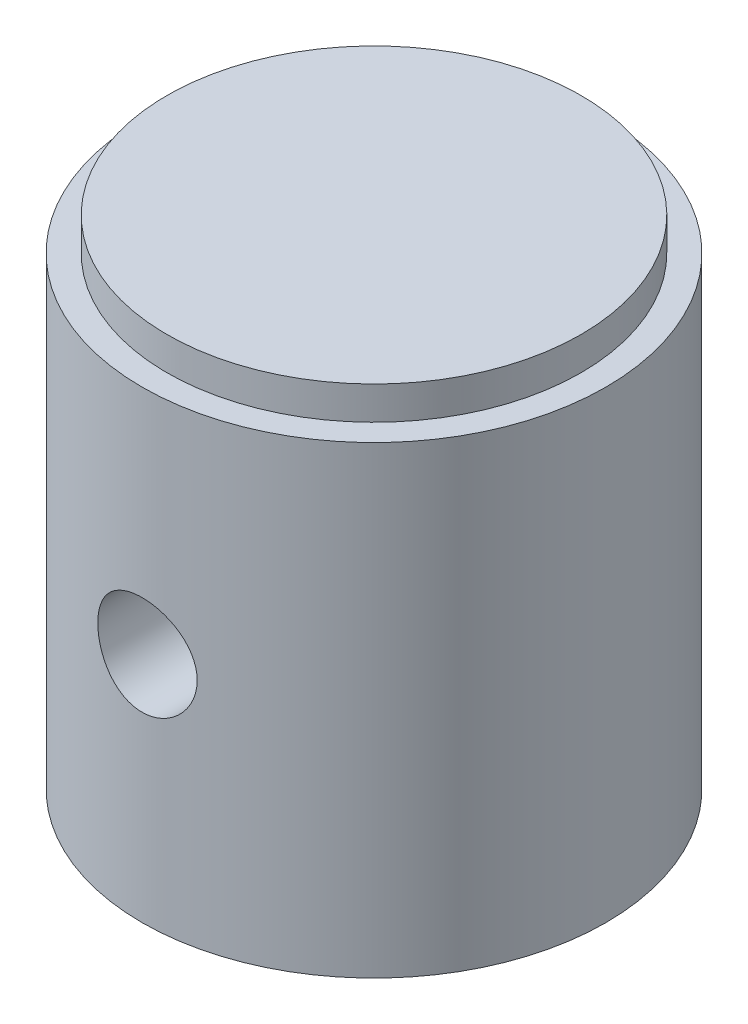
ISO-10303-21;
HEADER;
FILE_DESCRIPTION(('STEP AP214'),'2;1');
FILE_NAME('part.step','',(''),(''),'','','');
FILE_SCHEMA(('AUTOMOTIVE_DESIGN { 1 0 10303 214 1 1 1 1 }'));
ENDSEC;
DATA;
#1=APPLICATION_CONTEXT('core data for automotive mechanical design processes');
#2=APPLICATION_PROTOCOL_DEFINITION('international standard','automotive_design',2000,#1);
#3=PRODUCT_CONTEXT('',#1,'mechanical');
#4=PRODUCT('Part','Part','',(#3));
#5=PRODUCT_RELATED_PRODUCT_CATEGORY('part','',(#4));
#6=PRODUCT_DEFINITION_FORMATION('','',#4);
#7=PRODUCT_DEFINITION_CONTEXT('part definition',#1,'design');
#8=PRODUCT_DEFINITION('design','',#6,#7);
#9=PRODUCT_DEFINITION_SHAPE('','',#8);
#10=(LENGTH_UNIT() NAMED_UNIT(*) SI_UNIT(.MILLI.,.METRE.));
#11=(NAMED_UNIT(*) PLANE_ANGLE_UNIT() SI_UNIT($,.RADIAN.));
#12=(NAMED_UNIT(*) SI_UNIT($,.STERADIAN.) SOLID_ANGLE_UNIT());
#13=UNCERTAINTY_MEASURE_WITH_UNIT(LENGTH_MEASURE(1.E-05),#10,'distance_accuracy_value','');
#14=(GEOMETRIC_REPRESENTATION_CONTEXT(3) GLOBAL_UNCERTAINTY_ASSIGNED_CONTEXT((#13)) GLOBAL_UNIT_ASSIGNED_CONTEXT((#10,
#11,#12)) REPRESENTATION_CONTEXT('',''));
#15=CARTESIAN_POINT('',(0.,0.,0.));
#16=DIRECTION('',(0.,0.,1.));
#17=DIRECTION('',(1.,0.,0.));
#18=AXIS2_PLACEMENT_3D('',#15,#16,#17);
#19=CARTESIAN_POINT('',(-7.,-13.8540879403809,0.));
#20=DIRECTION('',(0.,1.,0.));
#21=DIRECTION('',(-1.,0.,0.));
#22=AXIS2_PLACEMENT_3D('',#19,#20,#21);
#23=PLANE('',#22);
#24=CARTESIAN_POINT('',(0.,-13.8540879403809,0.));
#25=DIRECTION('',(0.,-1.,0.));
#26=DIRECTION('',(1.,0.,0.));
#27=AXIS2_PLACEMENT_3D('',#24,#25,#26);
#28=CIRCLE('',#27,6.25);
#29=CARTESIAN_POINT('',(6.25000000000001,-13.8540879403809,0.));
#30=VERTEX_POINT('',#29);
#31=EDGE_CURVE('E62',#30,#30,#28,.T.);
#32=ORIENTED_EDGE('',*,*,#31,.F.);
#33=EDGE_LOOP('',(#32));
#34=FACE_BOUND('',#33,.T.);
#35=CARTESIAN_POINT('',(0.,-13.8540879403809,0.));
#36=DIRECTION('',(0.,-1.,0.));
#37=DIRECTION('',(1.,0.,0.));
#38=AXIS2_PLACEMENT_3D('',#35,#36,#37);
#39=CIRCLE('',#38,7.);
#40=CARTESIAN_POINT('',(7.,-13.8540879403809,0.));
#41=VERTEX_POINT('',#40);
#42=EDGE_CURVE('E116',#41,#41,#39,.T.);
#43=ORIENTED_EDGE('',*,*,#42,.T.);
#44=EDGE_LOOP('',(#43));
#45=FACE_BOUND('',#44,.T.);
#46=ADVANCED_FACE('F34',(#34,#45),#23,.F.);
#47=CARTESIAN_POINT('',(0.,-13.8540879403809,0.));
#48=DIRECTION('',(0.,-1.,0.));
#49=DIRECTION('',(1.,0.,0.));
#50=AXIS2_PLACEMENT_3D('',#47,#48,#49);
#51=CONICAL_SURFACE('',#50,6.25,0.349065850398867);
#52=CARTESIAN_POINT('',(0.,-9.73287181119897,0.));
#53=DIRECTION('',(0.,-1.,0.));
#54=DIRECTION('',(1.,0.,0.));
#55=AXIS2_PLACEMENT_3D('',#52,#53,#54);
#56=CIRCLE('',#55,4.75);
#57=CARTESIAN_POINT('',(4.75,-9.73287181119897,0.));
#58=VERTEX_POINT('',#57);
#59=EDGE_CURVE('E58',#58,#58,#56,.T.);
#60=ORIENTED_EDGE('',*,*,#59,.F.);
#61=EDGE_LOOP('',(#60));
#62=FACE_BOUND('',#61,.T.);
#63=ORIENTED_EDGE('',*,*,#31,.T.);
#64=EDGE_LOOP('',(#63));
#65=FACE_BOUND('',#64,.T.);
#66=ADVANCED_FACE('F100',(#62,#65),#51,.F.);
#67=CARTESIAN_POINT('',(0.,-1.1459120596191,0.));
#68=DIRECTION('',(0.,-1.,0.));
#69=DIRECTION('',(1.,0.,0.));
#70=AXIS2_PLACEMENT_3D('',#67,#68,#69);
#71=CYLINDRICAL_SURFACE('',#70,4.75);
#72=CARTESIAN_POINT('',(1.5,-6.8540879403809,-4.50693909432999));
#73=CARTESIAN_POINT('',(1.49999958004515,-6.93605622305704,-4.50693949515469));
#74=CARTESIAN_POINT('',(1.49325840231682,-7.01802892410564,-4.50919970874085));
#75=CARTESIAN_POINT('',(1.46655104887094,-7.17956294988035,-4.5179553253781));
#76=CARTESIAN_POINT('',(1.44658152131253,-7.25912365810358,-4.52445180182028));
#77=CARTESIAN_POINT('',(1.39417508352591,-7.41347014323043,-4.54087234787262));
#78=CARTESIAN_POINT('',(1.36176059537411,-7.48826422719241,-4.55079024986066));
#79=CARTESIAN_POINT('',(1.28545946652237,-7.63137399638555,-4.57292751994247));
#80=CARTESIAN_POINT('',(1.24157071835092,-7.69968848836886,-4.58514731070763));
#81=CARTESIAN_POINT('',(1.14191784971278,-7.83029661183296,-4.6109923380212));
#82=CARTESIAN_POINT('',(1.08582030493755,-7.89232950411681,-4.62464992232587));
#83=CARTESIAN_POINT('',(0.964055421977067,-8.00628229320441,-4.65155671093151));
#84=CARTESIAN_POINT('',(0.89838672023377,-8.05820074658454,-4.66480585671778));
#85=CARTESIAN_POINT('',(0.757464836701734,-8.15160644650628,-4.68977365915903));
#86=CARTESIAN_POINT('',(0.682025001056138,-8.19282445208425,-4.70144979545653));
#87=CARTESIAN_POINT('',(0.524852067423557,-8.26188519760547,-4.72157773016225));
#88=CARTESIAN_POINT('',(0.443120487221091,-8.28973115168705,-4.73003030329318));
#89=CARTESIAN_POINT('',(0.278414775826808,-8.33038467148202,-4.74252974850081));
#90=CARTESIAN_POINT('',(0.195560751143444,-8.34363804183695,-4.74670693307633));
#91=CARTESIAN_POINT('',(0.0287067286102967,-8.35614344447847,-4.75064554540298));
#92=CARTESIAN_POINT('',(-0.0552929988694204,-8.35539872489097,-4.75040799755164));
#93=CARTESIAN_POINT('',(-0.218913619351864,-8.34022074082502,-4.74563427350171));
#94=CARTESIAN_POINT('',(-0.298584494979865,-8.32627089066405,-4.74124990899214));
#95=CARTESIAN_POINT('',(-0.454390311754809,-8.28587278273048,-4.72886249486103));
#96=CARTESIAN_POINT('',(-0.530525020335841,-8.25942370418591,-4.72085920760149));
#97=CARTESIAN_POINT('',(-0.678203652675078,-8.19447175849607,-4.7019310355991));
#98=CARTESIAN_POINT('',(-0.749679013295809,-8.15582361270492,-4.69097118266663));
#99=CARTESIAN_POINT('',(-0.885279102378907,-8.06768762579376,-4.66728249867119));
#100=CARTESIAN_POINT('',(-0.949401935733848,-8.01819699955865,-4.65455321340063));
#101=CARTESIAN_POINT('',(-1.07135837440922,-7.90730597414598,-4.62803989727125));
#102=CARTESIAN_POINT('',(-1.12880871974839,-7.84548870632831,-4.61423403233704));
#103=CARTESIAN_POINT('',(-1.23264301054731,-7.71296978140175,-4.58758892442481));
#104=CARTESIAN_POINT('',(-1.2790255944206,-7.6422670328083,-4.57474980051078));
#105=CARTESIAN_POINT('',(-1.35986638692084,-7.49288116854965,-4.55138024059369));
#106=CARTESIAN_POINT('',(-1.39417963639867,-7.4141148017648,-4.54087839223385));
#107=CARTESIAN_POINT('',(-1.44893342452635,-7.25150983866529,-4.5237069894911));
#108=CARTESIAN_POINT('',(-1.46937907304313,-7.16767312306426,-4.51703602366211));
#109=CARTESIAN_POINT('',(-1.49507161979025,-7.00098558005699,-4.5085959379324));
#110=CARTESIAN_POINT('',(-1.50090655288536,-6.91823493670213,-4.50663729609299));
#111=CARTESIAN_POINT('',(-1.49886513965521,-6.75293022441442,-4.50731687465408));
#112=CARTESIAN_POINT('',(-1.49099096720734,-6.67037612639363,-4.50995436623754));
#113=CARTESIAN_POINT('',(-1.46228084598242,-6.51036125248343,-4.51934163323602));
#114=CARTESIAN_POINT('',(-1.4418371919129,-6.43282201971395,-4.5259668251803));
#115=CARTESIAN_POINT('',(-1.38903056686353,-6.28228400790209,-4.54245022183902));
#116=CARTESIAN_POINT('',(-1.35666562487664,-6.20928598201468,-4.55230896114271));
#117=CARTESIAN_POINT('',(-1.2798587413425,-6.06754623665939,-4.57450539166734));
#118=CARTESIAN_POINT('',(-1.2350921421442,-5.99899071210704,-4.58690698850857));
#119=CARTESIAN_POINT('',(-1.13512998682984,-5.87015089462233,-4.61266077618539));
#120=CARTESIAN_POINT('',(-1.07993166463933,-5.8098688028075,-4.62601321856053));
#121=CARTESIAN_POINT('',(-0.957886037531118,-5.69664616377291,-4.65285013455169));
#122=CARTESIAN_POINT('',(-0.890643665109766,-5.64412595749249,-4.66631614662306));
#123=CARTESIAN_POINT('',(-0.747973360630615,-5.55109663218957,-4.6912975579683));
#124=CARTESIAN_POINT('',(-0.672545793179843,-5.51058697846041,-4.70281304406929));
#125=CARTESIAN_POINT('',(-0.516099288450846,-5.44311557784927,-4.72253168708172));
#126=CARTESIAN_POINT('',(-0.435125281433141,-5.41605690859638,-4.73075845435933));
#127=CARTESIAN_POINT('',(-0.269469399491867,-5.3760348960379,-4.7430763734001));
#128=CARTESIAN_POINT('',(-0.184788721002361,-5.36306703891565,-4.74716884950256));
#129=CARTESIAN_POINT('',(-0.0179886485878234,-5.35196763711504,-4.7506674317259));
#130=CARTESIAN_POINT('',(0.0640868361538655,-5.35322953766588,-4.75026513795577));
#131=CARTESIAN_POINT('',(0.226803220963033,-5.36908248571695,-4.74528029002946));
#132=CARTESIAN_POINT('',(0.307444217580877,-5.38367263265262,-4.74069801830655));
#133=CARTESIAN_POINT('',(0.463969836764499,-5.42537900032378,-4.72793024704182));
#134=CARTESIAN_POINT('',(0.539902672774311,-5.4523298731285,-4.71979237633648));
#135=CARTESIAN_POINT('',(0.686204345183072,-5.51784279697551,-4.70075227796057));
#136=CARTESIAN_POINT('',(0.756572215112847,-5.55640685931676,-4.68984957149724));
#137=CARTESIAN_POINT('',(0.892382156713933,-5.64558525985437,-4.66594837362514));
#138=CARTESIAN_POINT('',(0.957571386267192,-5.69656861178656,-4.65289067194133));
#139=CARTESIAN_POINT('',(1.07867009763973,-5.80849115287936,-4.62631837968684));
#140=CARTESIAN_POINT('',(1.13457676425287,-5.8694333512703,-4.61280365200013));
#141=CARTESIAN_POINT('',(1.23744612372159,-6.00202938315304,-4.5863001606644));
#142=CARTESIAN_POINT('',(1.28403955823579,-6.07397723863897,-4.57334496349761));
#143=CARTESIAN_POINT('',(1.36442560849337,-6.22507399710157,-4.55001145096037));
#144=CARTESIAN_POINT('',(1.39822313048984,-6.30422012562592,-4.53963214845841));
#145=CARTESIAN_POINT('',(1.44974900503547,-6.46103439295214,-4.52342799882926));
#146=CARTESIAN_POINT('',(1.46853682069789,-6.5383243862388,-4.51730787458817));
#147=CARTESIAN_POINT('',(1.4936609032698,-6.69510456623347,-4.50906374742014));
#148=CARTESIAN_POINT('',(1.50000040727695,-6.77459417549262,-4.50693870560567));
#149=CARTESIAN_POINT('',(1.5,-6.8540879403809,-4.50693909432999));
#150=B_SPLINE_CURVE_WITH_KNOTS('',3,(#72,#73,#74,#75,#76,#77,#78,#79,#80,#81,#82,#83,#84,#85,
#86,#87,#88,#89,#90,#91,#92,#93,#94,#95,#96,#97,#98,#99,#100,#101,#102,#103,#104,#105,#106,#107,
#108,#109,#110,#111,#112,#113,#114,#115,#116,#117,#118,#119,#120,#121,#122,#123,#124,#125,#126,
#127,#128,#129,#130,#131,#132,#133,#134,#135,#136,#137,#138,#139,#140,#141,#142,#143,#144,#145,
#146,#147,#148,#149),.UNSPECIFIED.,.T.,.F.,(4,2,2,2,2,2,2,2,2,2,2,2,2,2,2,2,2,2,2,2,2,2,2,2,2,2,
2,2,2,2,2,2,2,2,2,2,2,2,4),(0.,0.245611090579273,0.491284438685785,0.736517218845768,
0.981795072467575,1.23487733964253,1.48799569757339,1.74697244897189,2.00588692090239,
2.25665093580603,2.50735676398231,2.74922580012767,2.99111072100683,3.2359924360223,
3.48093712787276,3.7362950135404,3.99168429786021,4.25004385973255,4.50830817072249,
4.75599786818586,5.00364829262799,5.24393641423545,5.48426428174336,5.73160040316639,
5.97900220045884,6.23690747266809,6.49480126127746,6.75080881416402,7.0067343340116,
7.25179355317672,7.49683621537552,7.73869250201122,7.98059070007259,8.23081327027949,
8.48111158966216,8.739930558781,8.99865018989115,9.23690856092584,9.47510496630383),.UNSPECIFIED.);
#151=CARTESIAN_POINT('',(1.5,-6.8540879403809,-4.50693909432999));
#152=VERTEX_POINT('',#151);
#153=EDGE_CURVE('E93',#152,#152,#150,.T.);
#154=ORIENTED_EDGE('',*,*,#153,.T.);
#155=EDGE_LOOP('',(#154));
#156=FACE_BOUND('',#155,.T.);
#157=CARTESIAN_POINT('',(1.5,-6.8540879403809,4.50693909432999));
#158=CARTESIAN_POINT('',(1.49999958004515,-6.77211965770476,4.50693949515469));
#159=CARTESIAN_POINT('',(1.49325840231682,-6.69014695665615,4.50919970874085));
#160=CARTESIAN_POINT('',(1.46655104887094,-6.52861293088145,4.5179553253781));
#161=CARTESIAN_POINT('',(1.44658152131253,-6.44905222265822,4.52445180182028));
#162=CARTESIAN_POINT('',(1.39417508352591,-6.29470573753137,4.54087234787262));
#163=CARTESIAN_POINT('',(1.36176059537411,-6.21991165356939,4.55079024986066));
#164=CARTESIAN_POINT('',(1.28545946652237,-6.07680188437625,4.57292751994247));
#165=CARTESIAN_POINT('',(1.24157071835092,-6.00848739239293,4.58514731070763));
#166=CARTESIAN_POINT('',(1.14191784971278,-5.87787926892884,4.6109923380212));
#167=CARTESIAN_POINT('',(1.08582030493755,-5.81584637664499,4.62464992232587));
#168=CARTESIAN_POINT('',(0.964055421977067,-5.70189358755739,4.65155671093151));
#169=CARTESIAN_POINT('',(0.89838672023377,-5.64997513417726,4.66480585671778));
#170=CARTESIAN_POINT('',(0.757464836701734,-5.55656943425552,4.68977365915903));
#171=CARTESIAN_POINT('',(0.682025001056138,-5.51535142867755,4.70144979545653));
#172=CARTESIAN_POINT('',(0.524852067423558,-5.44629068315632,4.72157773016225));
#173=CARTESIAN_POINT('',(0.443120487221092,-5.41844472907475,4.73003030329318));
#174=CARTESIAN_POINT('',(0.278414775826808,-5.37779120927978,4.74252974850081));
#175=CARTESIAN_POINT('',(0.195560751143444,-5.36453783892484,4.74670693307633));
#176=CARTESIAN_POINT('',(0.028706728610297,-5.35203243628333,4.75064554540298));
#177=CARTESIAN_POINT('',(-0.0552929988694203,-5.35277715587082,4.75040799755164));
#178=CARTESIAN_POINT('',(-0.218913619351864,-5.36795513993678,4.74563427350171));
#179=CARTESIAN_POINT('',(-0.298584494979865,-5.38190499009775,4.74124990899214));
#180=CARTESIAN_POINT('',(-0.45439031175481,-5.42230309803132,4.72886249486103));
#181=CARTESIAN_POINT('',(-0.530525020335842,-5.44875217657589,4.72085920760149));
#182=CARTESIAN_POINT('',(-0.678203652675078,-5.51370412226573,4.70193103559911));
#183=CARTESIAN_POINT('',(-0.74967901329581,-5.55235226805688,4.69097118266663));
#184=CARTESIAN_POINT('',(-0.885279102378908,-5.64048825496804,4.6672824986712));
#185=CARTESIAN_POINT('',(-0.949401935733847,-5.68997888120315,4.65455321340063));
#186=CARTESIAN_POINT('',(-1.07135837440922,-5.80086990661582,4.62803989727125));
#187=CARTESIAN_POINT('',(-1.12880871974839,-5.86268717443348,4.61423403233704));
#188=CARTESIAN_POINT('',(-1.23264301054731,-5.99520609936005,4.58758892442481));
#189=CARTESIAN_POINT('',(-1.2790255944206,-6.0659088479535,4.57474980051078));
#190=CARTESIAN_POINT('',(-1.35986638692084,-6.21529471221215,4.55138024059369));
#191=CARTESIAN_POINT('',(-1.39417963639867,-6.294061078997,4.54087839223385));
#192=CARTESIAN_POINT('',(-1.44893342452635,-6.45666604209651,4.5237069894911));
#193=CARTESIAN_POINT('',(-1.46937907304313,-6.54050275769754,4.51703602366211));
#194=CARTESIAN_POINT('',(-1.49507161979025,-6.70719030070481,4.5085959379324));
#195=CARTESIAN_POINT('',(-1.50090655288536,-6.78994094405967,4.50663729609299));
#196=CARTESIAN_POINT('',(-1.49886513965521,-6.95524565634738,4.50731687465408));
#197=CARTESIAN_POINT('',(-1.49099096720734,-7.03779975436817,4.50995436623754));
#198=CARTESIAN_POINT('',(-1.46228084598242,-7.19781462827837,4.51934163323602));
#199=CARTESIAN_POINT('',(-1.4418371919129,-7.27535386104785,4.5259668251803));
#200=CARTESIAN_POINT('',(-1.38903056686353,-7.42589187285971,4.54245022183902));
#201=CARTESIAN_POINT('',(-1.35666562487664,-7.49888989874712,4.55230896114271));
#202=CARTESIAN_POINT('',(-1.2798587413425,-7.64062964410241,4.57450539166734));
#203=CARTESIAN_POINT('',(-1.2350921421442,-7.70918516865476,4.58690698850857));
#204=CARTESIAN_POINT('',(-1.13512998682984,-7.83802498613947,4.61266077618539));
#205=CARTESIAN_POINT('',(-1.07993166463934,-7.8983070779543,4.62601321856053));
#206=CARTESIAN_POINT('',(-0.957886037531119,-8.01152971698889,4.65285013455169));
#207=CARTESIAN_POINT('',(-0.890643665109767,-8.06404992326931,4.66631614662306));
#208=CARTESIAN_POINT('',(-0.747973360630616,-8.15707924857223,4.6912975579683));
#209=CARTESIAN_POINT('',(-0.672545793179843,-8.19758890230138,4.70281304406929));
#210=CARTESIAN_POINT('',(-0.516099288450846,-8.26506030291253,4.72253168708172));
#211=CARTESIAN_POINT('',(-0.435125281433141,-8.29211897216542,4.73075845435933));
#212=CARTESIAN_POINT('',(-0.269469399491867,-8.3321409847239,4.7430763734001));
#213=CARTESIAN_POINT('',(-0.184788721002361,-8.34510884184615,4.74716884950256));
#214=CARTESIAN_POINT('',(-0.0179886485878248,-8.35620824364676,4.7506674317259));
#215=CARTESIAN_POINT('',(0.0640868361538641,-8.35494634309592,4.75026513795577));
#216=CARTESIAN_POINT('',(0.226803220963032,-8.33909339504485,4.74528029002946));
#217=CARTESIAN_POINT('',(0.307444217580876,-8.32450324810918,4.74069801830655));
#218=CARTESIAN_POINT('',(0.463969836764499,-8.28279688043802,4.72793024704182));
#219=CARTESIAN_POINT('',(0.539902672774311,-8.2558460076333,4.71979237633648));
#220=CARTESIAN_POINT('',(0.686204345183071,-8.19033308378629,4.70075227796057));
#221=CARTESIAN_POINT('',(0.756572215112847,-8.15176902144504,4.68984957149724));
#222=CARTESIAN_POINT('',(0.892382156713932,-8.06259062090743,4.66594837362514));
#223=CARTESIAN_POINT('',(0.957571386267191,-8.01160726897524,4.65289067194133));
#224=CARTESIAN_POINT('',(1.07867009763973,-7.89968472788244,4.62631837968684));
#225=CARTESIAN_POINT('',(1.13457676425287,-7.83874252949149,4.61280365200013));
#226=CARTESIAN_POINT('',(1.23744612372159,-7.70614649760876,4.5863001606644));
#227=CARTESIAN_POINT('',(1.28403955823579,-7.63419864212283,4.57334496349761));
#228=CARTESIAN_POINT('',(1.36442560849337,-7.48310188366023,4.55001145096037));
#229=CARTESIAN_POINT('',(1.39822313048984,-7.40395575513588,4.53963214845841));
#230=CARTESIAN_POINT('',(1.44974900503547,-7.24714148780966,4.52342799882926));
#231=CARTESIAN_POINT('',(1.46853682069789,-7.169851494523,4.51730787458817));
#232=CARTESIAN_POINT('',(1.4936609032698,-7.01307131452833,4.50906374742014));
#233=CARTESIAN_POINT('',(1.50000040727695,-6.93358170526918,4.50693870560567));
#234=CARTESIAN_POINT('',(1.5,-6.8540879403809,4.50693909432999));
#235=B_SPLINE_CURVE_WITH_KNOTS('',3,(#157,#158,#159,#160,#161,#162,#163,#164,#165,#166,#167,
#168,#169,#170,#171,#172,#173,#174,#175,#176,#177,#178,#179,#180,#181,#182,#183,#184,#185,#186,
#187,#188,#189,#190,#191,#192,#193,#194,#195,#196,#197,#198,#199,#200,#201,#202,#203,#204,#205,
#206,#207,#208,#209,#210,#211,#212,#213,#214,#215,#216,#217,#218,#219,#220,#221,#222,#223,#224,
#225,#226,#227,#228,#229,#230,#231,#232,#233,#234),.UNSPECIFIED.,.T.,.F.,(4,2,2,2,2,2,2,2,2,2,2,
2,2,2,2,2,2,2,2,2,2,2,2,2,2,2,2,2,2,2,2,2,2,2,2,2,2,2,4),(0.,0.245611090579273,
0.491284438685785,0.736517218845768,0.981795072467575,1.23487733964253,1.48799569757339,
1.74697244897189,2.00588692090239,2.25665093580603,2.50735676398231,2.74922580012767,
2.99111072100683,3.2359924360223,3.48093712787276,3.7362950135404,3.99168429786021,
4.25004385973256,4.50830817072249,4.75599786818586,5.00364829262799,5.24393641423545,
5.48426428174336,5.73160040316639,5.97900220045884,6.23690747266809,6.49480126127746,
6.75080881416402,7.0067343340116,7.25179355317672,7.49683621537552,7.73869250201122,
7.98059070007259,8.2308132702795,8.48111158966217,8.739930558781,8.99865018989115,
9.23690856092584,9.47510496630383),.UNSPECIFIED.);
#236=CARTESIAN_POINT('',(1.5,-6.8540879403809,4.50693909432999));
#237=VERTEX_POINT('',#236);
#238=EDGE_CURVE('E87',#237,#237,#235,.T.);
#239=ORIENTED_EDGE('',*,*,#238,.T.);
#240=EDGE_LOOP('',(#239));
#241=FACE_BOUND('',#240,.T.);
#242=CARTESIAN_POINT('',(0.,-2.8540879403809,0.));
#243=DIRECTION('',(0.,-1.,0.));
#244=DIRECTION('',(1.,0.,0.));
#245=AXIS2_PLACEMENT_3D('',#242,#243,#244);
#246=CIRCLE('',#245,4.75);
#247=CARTESIAN_POINT('',(4.75,-2.8540879403809,0.));
#248=VERTEX_POINT('',#247);
#249=EDGE_CURVE('E56',#248,#248,#246,.T.);
#250=ORIENTED_EDGE('',*,*,#249,.F.);
#251=EDGE_LOOP('',(#250));
#252=FACE_BOUND('',#251,.T.);
#253=ORIENTED_EDGE('',*,*,#59,.T.);
#254=EDGE_LOOP('',(#253));
#255=FACE_BOUND('',#254,.T.);
#256=ADVANCED_FACE('F52',(#156,#241,#252,#255),#71,.F.);
#257=CARTESIAN_POINT('',(0.,-2.8540879403809,0.));
#258=DIRECTION('',(0.,-1.,0.));
#259=DIRECTION('',(1.,0.,0.));
#260=AXIS2_PLACEMENT_3D('',#257,#258,#259);
#261=CONICAL_SURFACE('',#260,4.75,1.02974425867666);
#262=CARTESIAN_POINT('',(0.,0.,0.));
#263=VERTEX_POINT('',#262);
#264=VERTEX_LOOP('',#263);
#265=FACE_BOUND('',#264,.T.);
#266=ORIENTED_EDGE('',*,*,#249,.T.);
#267=EDGE_LOOP('',(#266));
#268=FACE_BOUND('',#267,.T.);
#269=ADVANCED_FACE('F48',(#265,#268),#261,.F.);
#270=CARTESIAN_POINT('',(0.,1.1459120596191,0.));
#271=DIRECTION('',(0.,-1.,0.));
#272=DIRECTION('',(1.,0.,0.));
#273=AXIS2_PLACEMENT_3D('',#270,#271,#272);
#274=PLANE('',#273);
#275=CARTESIAN_POINT('',(0.,1.1459120596191,0.));
#276=DIRECTION('',(0.,-1.,0.));
#277=DIRECTION('',(1.,0.,0.));
#278=AXIS2_PLACEMENT_3D('',#275,#276,#277);
#279=CIRCLE('',#278,6.25);
#280=CARTESIAN_POINT('',(6.25,1.1459120596191,0.));
#281=VERTEX_POINT('',#280);
#282=EDGE_CURVE('E59',#281,#281,#279,.T.);
#283=ORIENTED_EDGE('',*,*,#282,.F.);
#284=EDGE_LOOP('',(#283));
#285=FACE_BOUND('',#284,.T.);
#286=ADVANCED_FACE('F51',(#285),#274,.F.);
#287=CARTESIAN_POINT('',(0.,-1.1459120596191,0.));
#288=DIRECTION('',(0.,-1.,0.));
#289=DIRECTION('',(1.,0.,0.));
#290=AXIS2_PLACEMENT_3D('',#287,#288,#289);
#291=CYLINDRICAL_SURFACE('',#290,6.25);
#292=CARTESIAN_POINT('',(0.,0.145912059619102,0.));
#293=DIRECTION('',(0.,-1.,0.));
#294=DIRECTION('',(1.,0.,0.));
#295=AXIS2_PLACEMENT_3D('',#292,#293,#294);
#296=CIRCLE('',#295,6.25);
#297=CARTESIAN_POINT('',(6.25,0.145912059619103,0.));
#298=VERTEX_POINT('',#297);
#299=EDGE_CURVE('E65',#298,#298,#296,.T.);
#300=ORIENTED_EDGE('',*,*,#299,.F.);
#301=EDGE_LOOP('',(#300));
#302=FACE_BOUND('',#301,.T.);
#303=ORIENTED_EDGE('',*,*,#282,.T.);
#304=EDGE_LOOP('',(#303));
#305=FACE_BOUND('',#304,.T.);
#306=ADVANCED_FACE('F127',(#302,#305),#291,.T.);
#307=CARTESIAN_POINT('',(-6.25,0.145912059619101,0.));
#308=DIRECTION('',(0.,-1.,0.));
#309=DIRECTION('',(1.,0.,0.));
#310=AXIS2_PLACEMENT_3D('',#307,#308,#309);
#311=PLANE('',#310);
#312=CARTESIAN_POINT('',(0.,0.145912059619102,0.));
#313=DIRECTION('',(0.,-1.,0.));
#314=DIRECTION('',(1.,0.,0.));
#315=AXIS2_PLACEMENT_3D('',#312,#313,#314);
#316=CIRCLE('',#315,7.);
#317=CARTESIAN_POINT('',(7.,0.145912059619103,0.));
#318=VERTEX_POINT('',#317);
#319=EDGE_CURVE('E118',#318,#318,#316,.T.);
#320=ORIENTED_EDGE('',*,*,#319,.F.);
#321=EDGE_LOOP('',(#320));
#322=FACE_BOUND('',#321,.T.);
#323=ORIENTED_EDGE('',*,*,#299,.T.);
#324=EDGE_LOOP('',(#323));
#325=FACE_BOUND('',#324,.T.);
#326=ADVANCED_FACE('F125',(#322,#325),#311,.F.);
#327=CARTESIAN_POINT('',(0.,-1.1459120596191,0.));
#328=DIRECTION('',(0.,-1.,0.));
#329=DIRECTION('',(1.,0.,0.));
#330=AXIS2_PLACEMENT_3D('',#327,#328,#329);
#331=CYLINDRICAL_SURFACE('',#330,7.);
#332=CARTESIAN_POINT('',(0.,-8.3540879403809,-7.));
#333=CARTESIAN_POINT('',(0.0832358860906179,-8.3540850408066,-6.99999846043226));
#334=CARTESIAN_POINT('',(0.166507195600276,-8.34713633199304,-6.9985002594971));
#335=CARTESIAN_POINT('',(0.330687344293328,-8.3195522835273,-6.99266829827727));
#336=CARTESIAN_POINT('',(0.411594403571191,-8.29890689618596,-6.98833245637099));
#337=CARTESIAN_POINT('',(0.568649323817738,-8.24460357577286,-6.97730831788826));
#338=CARTESIAN_POINT('',(0.644801963446557,-8.21095896099958,-6.97062242967171));
#339=CARTESIAN_POINT('',(0.790378177960788,-8.13165385420963,-6.95562106817971));
#340=CARTESIAN_POINT('',(0.859801981747371,-8.08599377113096,-6.9473056503666));
#341=CARTESIAN_POINT('',(0.991024790535231,-7.98320764070739,-6.92981369246311));
#342=CARTESIAN_POINT('',(1.05270503419445,-7.92593171848237,-6.92062683143259));
#343=CARTESIAN_POINT('',(1.16566042389435,-7.8018616246957,-6.90250069814144));
#344=CARTESIAN_POINT('',(1.21693467150908,-7.73506663212964,-6.8935614473163));
#345=CARTESIAN_POINT('',(1.30814204379809,-7.59298218752047,-6.87684116047225));
#346=CARTESIAN_POINT('',(1.34794958335009,-7.51761042262469,-6.8690733634436));
#347=CARTESIAN_POINT('',(1.41428823691148,-7.36105348661406,-6.85572325558537));
#348=CARTESIAN_POINT('',(1.44082087001716,-7.27986898188832,-6.85014069470711));
#349=CARTESIAN_POINT('',(1.47946574422454,-7.11527685379282,-6.8418980892631));
#350=CARTESIAN_POINT('',(1.49178779748342,-7.03192066471703,-6.83919556896486));
#351=CARTESIAN_POINT('',(1.50231395206577,-6.8642837078739,-6.83689139845106));
#352=CARTESIAN_POINT('',(1.50051971664629,-6.78000305020095,-6.83728938291729));
#353=CARTESIAN_POINT('',(1.48303326340861,-6.6144632524471,-6.84110276603832));
#354=CARTESIAN_POINT('',(1.46758398649408,-6.53317705128074,-6.84446541682162));
#355=CARTESIAN_POINT('',(1.42361054298677,-6.37437770009156,-6.85374593375788));
#356=CARTESIAN_POINT('',(1.39508566936466,-6.29686475434858,-6.85966393808402));
#357=CARTESIAN_POINT('',(1.32554551075991,-6.14712506750756,-6.87344080755724));
#358=CARTESIAN_POINT('',(1.2844361097283,-6.07494342766835,-6.88131420983365));
#359=CARTESIAN_POINT('',(1.19096007283993,-5.93841277542294,-6.89810572501288));
#360=CARTESIAN_POINT('',(1.13859196103562,-5.8740647916947,-6.90702397481896));
#361=CARTESIAN_POINT('',(1.0227954275532,-5.7536285847075,-6.92512718393878));
#362=CARTESIAN_POINT('',(0.959160233964408,-5.69773923379616,-6.93431383972178));
#363=CARTESIAN_POINT('',(0.823317306269095,-5.59739420669124,-6.95175017497059));
#364=CARTESIAN_POINT('',(0.751109428775398,-5.55293872178051,-6.95999983875972));
#365=CARTESIAN_POINT('',(0.599933462049958,-5.47667726047397,-6.97465778534003));
#366=CARTESIAN_POINT('',(0.520952258863481,-5.44489652780292,-6.98106238643354));
#367=CARTESIAN_POINT('',(0.358603146685705,-5.39511229205981,-6.99128109245334));
#368=CARTESIAN_POINT('',(0.275235851133667,-5.37710686781758,-6.99509555860384));
#369=CARTESIAN_POINT('',(0.108187670836627,-5.35567172623748,-6.99965306347808));
#370=CARTESIAN_POINT('',(0.0245431772716126,-5.35197022749912,-7.00045336521066));
#371=CARTESIAN_POINT('',(-0.142168973650407,-5.35851251150606,-6.99905248935969));
#372=CARTESIAN_POINT('',(-0.225236668127257,-5.36875538834384,-6.99685150675698));
#373=CARTESIAN_POINT('',(-0.387542537982807,-5.4026701840426,-6.98973143045266));
#374=CARTESIAN_POINT('',(-0.466811712908479,-5.42620030985343,-6.98484105045459));
#375=CARTESIAN_POINT('',(-0.620278450473419,-5.48586488337572,-6.9728892442151));
#376=CARTESIAN_POINT('',(-0.694475592587741,-5.52200037469255,-6.96582763822237));
#377=CARTESIAN_POINT('',(-0.836821397964755,-5.60642148344123,-6.950175043904));
#378=CARTESIAN_POINT('',(-0.904872575111141,-5.65486773529063,-6.94156431354275));
#379=CARTESIAN_POINT('',(-1.0319769255236,-5.76232276526964,-6.92381033034847));
#380=CARTESIAN_POINT('',(-1.091028978692,-5.82133285626834,-6.91466701142097));
#381=CARTESIAN_POINT('',(-1.19952711057989,-5.94948531056804,-6.89668172706324));
#382=CARTESIAN_POINT('',(-1.24878537255157,-6.018788039603,-6.88784792221285));
#383=CARTESIAN_POINT('',(-1.33496415386041,-6.16484253685889,-6.87166654559681));
#384=CARTESIAN_POINT('',(-1.37188519913706,-6.24159398735839,-6.86431891048055));
#385=CARTESIAN_POINT('',(-1.43209741248548,-6.3999602393755,-6.8520100980739));
#386=CARTESIAN_POINT('',(-1.45546398641275,-6.48154529681157,-6.84703574582967));
#387=CARTESIAN_POINT('',(-1.48812696085335,-6.64760352421454,-6.84001186708418));
#388=CARTESIAN_POINT('',(-1.49742550780258,-6.73207625158222,-6.83796189439706));
#389=CARTESIAN_POINT('',(-1.5015999992604,-6.89962028355614,-6.83704618848155));
#390=CARTESIAN_POINT('',(-1.49677347258311,-6.98268395536148,-6.83811476518543));
#391=CARTESIAN_POINT('',(-1.47349789406331,-7.14678518251349,-6.8431676318483));
#392=CARTESIAN_POINT('',(-1.45504898957979,-7.22782275976747,-6.84715189026714));
#393=CARTESIAN_POINT('',(-1.40519345940434,-7.38534659825007,-6.85755581104157));
#394=CARTESIAN_POINT('',(-1.37382847170887,-7.46184658904519,-6.86396764224703));
#395=CARTESIAN_POINT('',(-1.29906751595601,-7.60854331288775,-6.87850764590649));
#396=CARTESIAN_POINT('',(-1.255670353015,-7.67873941899594,-6.88663598880363));
#397=CARTESIAN_POINT('',(-1.15708290349304,-7.81230613410627,-6.90389055593232));
#398=CARTESIAN_POINT('',(-1.10167987421236,-7.87551763632788,-6.91303309938926));
#399=CARTESIAN_POINT('',(-0.981086554619619,-7.99184420290136,-6.93117449799694));
#400=CARTESIAN_POINT('',(-0.915894009385595,-8.04495693469311,-6.94017331951296));
#401=CARTESIAN_POINT('',(-0.776603147268715,-8.14020389988646,-6.95714491048987));
#402=CARTESIAN_POINT('',(-0.702404846009639,-8.18219454661188,-6.96510364570626));
#403=CARTESIAN_POINT('',(-0.547850160940596,-8.25304246928708,-6.97895826104019));
#404=CARTESIAN_POINT('',(-0.467499105863878,-8.28191096296593,-6.98485590212343));
#405=CARTESIAN_POINT('',(-0.322535217553203,-8.32044012551205,-6.99284848461772));
#406=CARTESIAN_POINT('',(-0.258717205545978,-8.33303437436093,-6.99551391888263));
#407=CARTESIAN_POINT('',(-0.129939960853846,-8.34985924209257,-6.99909024154719));
#408=CARTESIAN_POINT('',(-0.0649807750887439,-8.35409020402696,-7.00000120191314));
#409=CARTESIAN_POINT('',(0.,-8.3540879403809,-7.));
#410=B_SPLINE_CURVE_WITH_KNOTS('',3,(#332,#333,#334,#335,#336,#337,#338,#339,#340,#341,#342,
#343,#344,#345,#346,#347,#348,#349,#350,#351,#352,#353,#354,#355,#356,#357,#358,#359,#360,#361,
#362,#363,#364,#365,#366,#367,#368,#369,#370,#371,#372,#373,#374,#375,#376,#377,#378,#379,#380,
#381,#382,#383,#384,#385,#386,#387,#388,#389,#390,#391,#392,#393,#394,#395,#396,#397,#398,#399,
#400,#401,#402,#403,#404,#405,#406,#407,#408,#409),.UNSPECIFIED.,.T.,.F.,(4,2,2,2,2,2,2,2,2,2,2,
2,2,2,2,2,2,2,2,2,2,2,2,2,2,2,2,2,2,2,2,2,2,2,2,2,2,2,4),(0.,0.249469836512082,
0.499122883219936,0.748520824425602,0.997910278645886,1.25074961881732,1.50361077918506,
1.7591442921451,2.0146485567749,2.26633008124666,2.51798195169165,2.76524475452928,
3.01252092904568,3.26169356165968,3.51089887920889,3.76527011050291,4.0196455970235,
4.27452521139806,4.52936927256343,4.77934665704185,5.02930780231429,5.27665060589267,
5.52401389198434,5.77478733867803,6.02559197304485,6.28082063283534,6.53603841075806,
6.78982240408475,7.04356767229185,7.29200680540294,7.5404432510827,7.78808499706785,
8.03575134451623,8.28822950154114,8.54076590397115,8.79641910357222,9.05185334010271,
9.24661799132294,9.44137465337336),.UNSPECIFIED.);
#411=CARTESIAN_POINT('',(0.,-8.3540879403809,-7.));
#412=VERTEX_POINT('',#411);
#413=EDGE_CURVE('E11',#412,#412,#410,.T.);
#414=ORIENTED_EDGE('',*,*,#413,.T.);
#415=EDGE_LOOP('',(#414));
#416=FACE_BOUND('',#415,.T.);
#417=CARTESIAN_POINT('',(1.5,-6.8540879403809,6.83739716558867));
#418=CARTESIAN_POINT('',(1.49999708238613,-6.93729909286285,6.83739884558951));
#419=CARTESIAN_POINT('',(1.49305236244768,-7.02054571432302,6.83893272341929));
#420=CARTESIAN_POINT('',(1.46548559252999,-7.1846746126229,6.84489178429867));
#421=CARTESIAN_POINT('',(1.44485339653622,-7.2655550890571,6.84931911211841));
#422=CARTESIAN_POINT('',(1.39058863684599,-7.4225536899551,6.86054115293409));
#423=CARTESIAN_POINT('',(1.35697000991314,-7.49867681850237,6.86733332725825));
#424=CARTESIAN_POINT('',(1.27772617673341,-7.64420321432551,6.88251670848644));
#425=CARTESIAN_POINT('',(1.23210132048776,-7.71360667740997,6.89090786877545));
#426=CARTESIAN_POINT('',(1.12935142570221,-7.84485090186302,6.90849578796654));
#427=CARTESIAN_POINT('',(1.07206859483983,-7.90656681662086,6.91770249871753));
#428=CARTESIAN_POINT('',(0.947969508129577,-8.01959149478668,6.93579691710397));
#429=CARTESIAN_POINT('',(0.881152530217676,-8.07089946924097,6.94468460051416));
#430=CARTESIAN_POINT('',(0.739047288464582,-8.16214338487233,6.96124769109432));
#431=CARTESIAN_POINT('',(0.663680488229953,-8.20195959615152,6.96890998819429));
#432=CARTESIAN_POINT('',(0.507134269342595,-8.26831563182719,6.98204671042934));
#433=CARTESIAN_POINT('',(0.425955477380312,-8.29485688516718,6.98752137103329));
#434=CARTESIAN_POINT('',(0.261387187671513,-8.33351791131224,6.9955956528118));
#435=CARTESIAN_POINT('',(0.178049400596924,-8.34584886893333,6.99823733378385));
#436=CARTESIAN_POINT('',(0.0104489453066446,-8.35639921769416,7.00049362207002));
#437=CARTESIAN_POINT('',(-0.0738136201647593,-8.35462016094165,7.00010856232698));
#438=CARTESIAN_POINT('',(-0.239417029250512,-8.33715897571732,6.99638700862558));
#439=CARTESIAN_POINT('',(-0.320783115362113,-8.32170444009098,6.99309883152431));
#440=CARTESIAN_POINT('',(-0.479739463978389,-8.27769325852904,6.98399541589104));
#441=CARTESIAN_POINT('',(-0.557329560175054,-8.24913603608116,6.97818006616518));
#442=CARTESIAN_POINT('',(-0.707167497556553,-8.17952648149238,6.96459754646858));
#443=CARTESIAN_POINT('',(-0.779373657015788,-8.13838717317655,6.95681685803946));
#444=CARTESIAN_POINT('',(-0.915940926562846,-8.0448459722173,6.94015793743865));
#445=CARTESIAN_POINT('',(-0.980301006451528,-7.9924426030806,6.93127956144693));
#446=CARTESIAN_POINT('',(-1.10070208800198,-7.87661939585304,6.91319326460925));
#447=CARTESIAN_POINT('',(-1.1565511732025,-7.81300036102386,6.90398230372853));
#448=CARTESIAN_POINT('',(-1.25682243234728,-7.67720465531239,6.88643566831974));
#449=CARTESIAN_POINT('',(-1.30124432118068,-7.60502777097565,6.87810001563386));
#450=CARTESIAN_POINT('',(-1.37748077573296,-7.45386343931714,6.86324023586723));
#451=CARTESIAN_POINT('',(-1.40926035088923,-7.37485781652846,6.85672115127775));
#452=CARTESIAN_POINT('',(-1.45903495159115,-7.21245517443446,6.84630340806616));
#453=CARTESIAN_POINT('',(-1.47703206694628,-7.12905882293771,6.84240435218483));
#454=CARTESIAN_POINT('',(-1.49843586024652,-6.96199218773118,6.83774881255446));
#455=CARTESIAN_POINT('',(-1.5021214192864,-6.87835926530359,6.83693227051701));
#456=CARTESIAN_POINT('',(-1.49555139642373,-6.7116739471992,6.83837239573994));
#457=CARTESIAN_POINT('',(-1.48529673081635,-6.62862151372735,6.84062886101063));
#458=CARTESIAN_POINT('',(-1.45137894635584,-6.46641750540014,6.84790415484205));
#459=CARTESIAN_POINT('',(-1.42786830251553,-6.38723250778394,6.85289155274364));
#460=CARTESIAN_POINT('',(-1.36827052946749,-6.23392560284798,6.86503859869777));
#461=CARTESIAN_POINT('',(-1.33218223662818,-6.15980416474671,6.87219844772849));
#462=CARTESIAN_POINT('',(-1.24783504416705,-6.01751825562198,6.88801634080345));
#463=CARTESIAN_POINT('',(-1.19940368590792,-5.94945835836871,6.89669501746317));
#464=CARTESIAN_POINT('',(-1.09197183833601,-5.8223295945071,6.91451775360139));
#465=CARTESIAN_POINT('',(-1.03297009182161,-5.76326179893243,6.92366186834461));
#466=CARTESIAN_POINT('',(-0.904812764420814,-5.65471763743614,6.94158239990173));
#467=CARTESIAN_POINT('',(-0.835494925828771,-5.60543102422389,6.95034935607746));
#468=CARTESIAN_POINT('',(-0.689401481282276,-5.51920253102985,6.96635610714901));
#469=CARTESIAN_POINT('',(-0.612626216043739,-5.48226008740807,6.97359597176692));
#470=CARTESIAN_POINT('',(-0.45426541898204,-5.42203588574242,6.98569278381574));
#471=CARTESIAN_POINT('',(-0.372713193075172,-5.39866963663462,6.99056443803698));
#472=CARTESIAN_POINT('',(-0.206725177003289,-5.36599623464858,6.9974393930198));
#473=CARTESIAN_POINT('',(-0.122289789973993,-5.35668712440699,6.99944309312296));
#474=CARTESIAN_POINT('',(0.0452637170528291,-5.35247728796904,7.00034511009056));
#475=CARTESIAN_POINT('',(0.128374505509229,-5.35729278177627,6.99930459001667));
#476=CARTESIAN_POINT('',(0.29257293841596,-5.38056270389993,6.99436552363383));
#477=CARTESIAN_POINT('',(0.373660616405285,-5.39901690595922,6.99046702473686));
#478=CARTESIAN_POINT('',(0.53130194848727,-5.44890674663039,6.98025388638537));
#479=CARTESIAN_POINT('',(0.607868365073178,-5.48030362976646,6.97394646430492));
#480=CARTESIAN_POINT('',(0.754684956723221,-5.55514921155002,6.9595903605066));
#481=CARTESIAN_POINT('',(0.824934544796142,-5.59859902868693,6.9515415172034));
#482=CARTESIAN_POINT('',(0.958512306895244,-5.69725025912357,6.93439809934493));
#483=CARTESIAN_POINT('',(1.02169036510577,-5.75265209870221,6.92528708907874));
#484=CARTESIAN_POINT('',(1.13795001457643,-5.87322855063125,6.90713690075836));
#485=CARTESIAN_POINT('',(1.19102918062422,-5.9384055037365,6.89809774045682));
#486=CARTESIAN_POINT('',(1.28623261596675,-6.07767843356657,6.88098693651915));
#487=CARTESIAN_POINT('',(1.32820897809616,-6.15187729866792,6.87292905956533));
#488=CARTESIAN_POINT('',(1.39903004659825,-6.30643166130415,6.85886497228049));
#489=CARTESIAN_POINT('',(1.42788606423931,-6.38678178563397,6.85285699581573));
#490=CARTESIAN_POINT('',(1.46638607121558,-6.53171407156676,6.84470560641996));
#491=CARTESIAN_POINT('',(1.47896752507743,-6.59549961608873,6.84198283087953));
#492=CARTESIAN_POINT('',(1.49577544043437,-6.72421225195822,6.83832799504405));
#493=CARTESIAN_POINT('',(1.50000227727981,-6.78913929188922,6.83739585430069));
#494=CARTESIAN_POINT('',(1.5,-6.8540879403809,6.83739716558867));
#495=B_SPLINE_CURVE_WITH_KNOTS('',3,(#417,#418,#419,#420,#421,#422,#423,#424,#425,#426,#427,
#428,#429,#430,#431,#432,#433,#434,#435,#436,#437,#438,#439,#440,#441,#442,#443,#444,#445,#446,
#447,#448,#449,#450,#451,#452,#453,#454,#455,#456,#457,#458,#459,#460,#461,#462,#463,#464,#465,
#466,#467,#468,#469,#470,#471,#472,#473,#474,#475,#476,#477,#478,#479,#480,#481,#482,#483,#484,
#485,#486,#487,#488,#489,#490,#491,#492,#493,#494),.UNSPECIFIED.,.T.,.F.,(4,2,2,2,2,2,2,2,2,2,2,
2,2,2,2,2,2,2,2,2,2,2,2,2,2,2,2,2,2,2,2,2,2,2,2,2,2,2,4),(0.,0.249395482027528,
0.498976038479964,0.748289491152759,0.997595676735283,1.25053229582692,1.50348808112879,
1.75899134820278,2.01446710646267,2.26609508151929,2.51769537777241,2.76518557667372,
3.01268666607584,3.26193888143437,3.51122378872315,3.76548960779295,4.01976177023092,
4.27473287411781,4.52966530953839,4.77960433192523,5.02952692653917,5.27663180749375,
5.5237595556315,5.77455010216318,6.02537049659078,6.2806621468321,6.53594213875541,
6.78961589824375,7.04325433208539,7.29183199644126,7.540405537151,7.78824009619483,
8.03609766151365,8.28848914160965,8.54094115631232,8.79660380167249,9.05204561611687,
9.24671456122272,9.44137476018022),.UNSPECIFIED.);
#496=CARTESIAN_POINT('',(1.5,-6.8540879403809,6.83739716558867));
#497=VERTEX_POINT('',#496);
#498=EDGE_CURVE('E45',#497,#497,#495,.T.);
#499=ORIENTED_EDGE('',*,*,#498,.T.);
#500=EDGE_LOOP('',(#499));
#501=FACE_BOUND('',#500,.T.);
#502=ORIENTED_EDGE('',*,*,#42,.F.);
#503=EDGE_LOOP('',(#502));
#504=FACE_BOUND('',#503,.T.);
#505=ORIENTED_EDGE('',*,*,#319,.T.);
#506=EDGE_LOOP('',(#505));
#507=FACE_BOUND('',#506,.T.);
#508=ADVANCED_FACE('F74',(#416,#501,#504,#507),#331,.T.);
#509=CARTESIAN_POINT('',(0.,-6.8540879403809,-7.));
#510=DIRECTION('',(0.,0.,1.));
#511=DIRECTION('',(1.,0.,0.));
#512=AXIS2_PLACEMENT_3D('',#509,#510,#511);
#513=CYLINDRICAL_SURFACE('',#512,1.5);
#514=ORIENTED_EDGE('',*,*,#498,.F.);
#515=EDGE_LOOP('',(#514));
#516=FACE_BOUND('',#515,.T.);
#517=ORIENTED_EDGE('',*,*,#238,.F.);
#518=EDGE_LOOP('',(#517));
#519=FACE_BOUND('',#518,.T.);
#520=ADVANCED_FACE('F80',(#516,#519),#513,.F.);
#521=ORIENTED_EDGE('',*,*,#413,.F.);
#522=EDGE_LOOP('',(#521));
#523=FACE_BOUND('',#522,.T.);
#524=ORIENTED_EDGE('',*,*,#153,.F.);
#525=EDGE_LOOP('',(#524));
#526=FACE_BOUND('',#525,.T.);
#527=ADVANCED_FACE('F77',(#523,#526),#513,.F.);
#528=CLOSED_SHELL('',(#46,#66,#256,#269,#286,#306,#326,#508,#520,#527));
#529=MANIFOLD_SOLID_BREP('B2',#528);
#530=ADVANCED_BREP_SHAPE_REPRESENTATION('',(#18,#529),#14);
#531=SHAPE_DEFINITION_REPRESENTATION(#9,#530);
ENDSEC;
END-ISO-10303-21;
